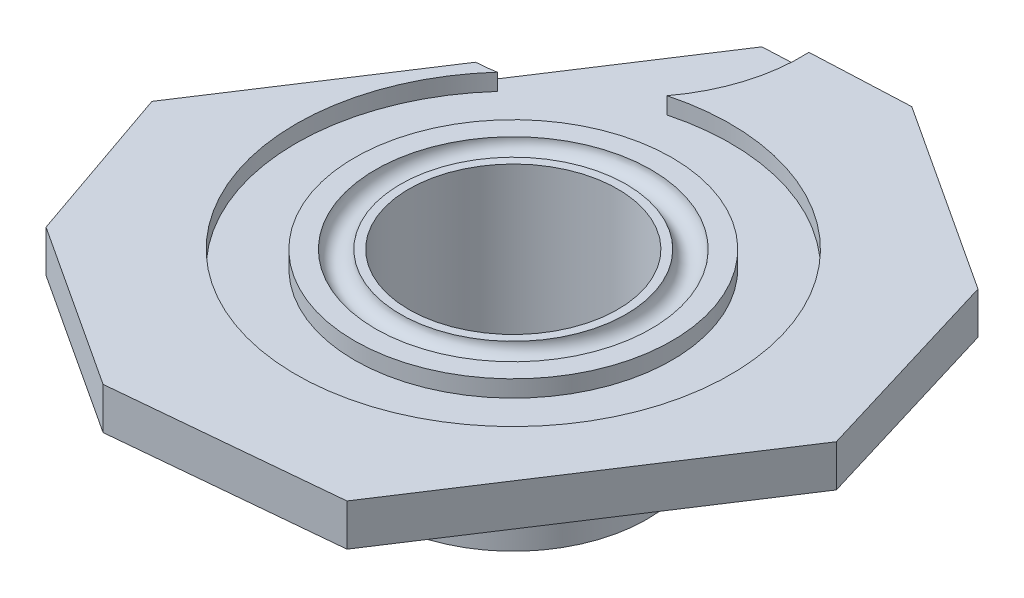
ISO-10303-21;
HEADER;
FILE_DESCRIPTION(('STEP AP214'),'2;1');
FILE_NAME('part.step','',(''),(''),'','','');
FILE_SCHEMA(('AUTOMOTIVE_DESIGN { 1 0 10303 214 1 1 1 1 }'));
ENDSEC;
DATA;
#1=APPLICATION_CONTEXT('core data for automotive mechanical design processes');
#2=APPLICATION_PROTOCOL_DEFINITION('international standard','automotive_design',2000,#1);
#3=PRODUCT_CONTEXT('',#1,'mechanical');
#4=PRODUCT('Part','Part','',(#3));
#5=PRODUCT_RELATED_PRODUCT_CATEGORY('part','',(#4));
#6=PRODUCT_DEFINITION_FORMATION('','',#4);
#7=PRODUCT_DEFINITION_CONTEXT('part definition',#1,'design');
#8=PRODUCT_DEFINITION('design','',#6,#7);
#9=PRODUCT_DEFINITION_SHAPE('','',#8);
#10=(LENGTH_UNIT() NAMED_UNIT(*) SI_UNIT(.MILLI.,.METRE.));
#11=(NAMED_UNIT(*) PLANE_ANGLE_UNIT() SI_UNIT($,.RADIAN.));
#12=(NAMED_UNIT(*) SI_UNIT($,.STERADIAN.) SOLID_ANGLE_UNIT());
#13=UNCERTAINTY_MEASURE_WITH_UNIT(LENGTH_MEASURE(1.E-05),#10,'distance_accuracy_value','');
#14=(GEOMETRIC_REPRESENTATION_CONTEXT(3) GLOBAL_UNCERTAINTY_ASSIGNED_CONTEXT((#13)) GLOBAL_UNIT_ASSIGNED_CONTEXT((#10,
#11,#12)) REPRESENTATION_CONTEXT('',''));
#15=CARTESIAN_POINT('',(0.,0.,0.));
#16=DIRECTION('',(0.,0.,1.));
#17=DIRECTION('',(1.,0.,0.));
#18=AXIS2_PLACEMENT_3D('',#15,#16,#17);
#19=CARTESIAN_POINT('',(0.,20.,0.));
#20=DIRECTION('',(0.,1.,0.));
#21=DIRECTION('',(0.,0.,1.));
#22=AXIS2_PLACEMENT_3D('',#19,#20,#21);
#23=PLANE('',#22);
#24=CARTESIAN_POINT('',(-22.7595405446769,20.,-37.1642927951292));
#25=DIRECTION('',(0.,1.,0.));
#26=DIRECTION('',(0.,0.,1.));
#27=AXIS2_PLACEMENT_3D('',#24,#25,#26);
#28=CIRCLE('',#27,20.0570658458404);
#29=CARTESIAN_POINT('',(-21.6470935139552,20.,-17.1381011464852));
#30=VERTEX_POINT('',#29);
#31=CARTESIAN_POINT('',(-19.3146669349685,20.,-17.4052762164249));
#32=VERTEX_POINT('',#31);
#33=EDGE_CURVE('E185',#30,#32,#28,.T.);
#34=ORIENTED_EDGE('',*,*,#33,.F.);
#35=DIRECTION('',(-0.546970069085976,0.,0.837152162706448));
#36=VECTOR('',#35,1.);
#37=CARTESIAN_POINT('',(-36.9589347677914,20.,6.29707701982124));
#38=LINE('',#37,#36);
#39=CARTESIAN_POINT('',(-36.9589347677914,20.,6.29707701982125));
#40=VERTEX_POINT('',#39);
#41=EDGE_CURVE('E53',#30,#40,#38,.T.);
#42=ORIENTED_EDGE('',*,*,#41,.T.);
#43=DIRECTION('',(0.326695918463785,0.,0.945129502692146));
#44=VECTOR('',#43,1.);
#45=CARTESIAN_POINT('',(-30.2604215395463,20.,25.6758390991212));
#46=LINE('',#45,#44);
#47=CARTESIAN_POINT('',(-30.2604215395463,20.,25.6758390991212));
#48=VERTEX_POINT('',#47);
#49=EDGE_CURVE('E122',#40,#48,#46,.T.);
#50=ORIENTED_EDGE('',*,*,#49,.T.);
#51=DIRECTION('',(0.837169104331042,0.,0.546944138604265));
#52=VECTOR('',#51,1.);
#53=CARTESIAN_POINT('',(-10.5432375414023,20.,38.5575832554395));
#54=LINE('',#53,#52);
#55=CARTESIAN_POINT('',(-10.5432375414023,20.,38.5575832554395));
#56=VERTEX_POINT('',#55);
#57=EDGE_CURVE('E130',#48,#56,#54,.T.);
#58=ORIENTED_EDGE('',*,*,#57,.T.);
#59=DIRECTION('',(0.995607651322571,0.,-0.0936237396601654));
#60=VECTOR('',#59,1.);
#61=CARTESIAN_POINT('',(-10.5432375414023,20.,38.5575832554395));
#62=LINE('',#61,#60);
#63=CARTESIAN_POINT('',(16.1383519412033,20.,36.0485324419786));
#64=VERTEX_POINT('',#63);
#65=EDGE_CURVE('E136',#56,#64,#62,.T.);
#66=ORIENTED_EDGE('',*,*,#65,.T.);
#67=DIRECTION('',(0.546944138604265,0.,-0.837169104331042));
#68=VECTOR('',#67,1.);
#69=CARTESIAN_POINT('',(16.1383519412033,20.,36.0485324419786));
#70=LINE('',#69,#68);
#71=CARTESIAN_POINT('',(39.2880738807601,20.,0.614873657175752));
#72=VERTEX_POINT('',#71);
#73=EDGE_CURVE('E143',#64,#72,#70,.T.);
#74=ORIENTED_EDGE('',*,*,#73,.T.);
#75=DIRECTION('',(-0.289578558466997,0.,-0.957154250095655));
#76=VECTOR('',#75,1.);
#77=CARTESIAN_POINT('',(39.2880738807601,20.,0.614873657175752));
#78=LINE('',#77,#76);
#79=CARTESIAN_POINT('',(31.9335101240895,20.,-23.6944260180591));
#80=VERTEX_POINT('',#79);
#81=EDGE_CURVE('E146',#72,#80,#78,.T.);
#82=ORIENTED_EDGE('',*,*,#81,.T.);
#83=DIRECTION('',(-0.837169104331041,0.,-0.546944138604265));
#84=VECTOR('',#83,1.);
#85=CARTESIAN_POINT('',(31.9335101240895,20.,-23.6944260180591));
#86=LINE('',#85,#84);
#87=CARTESIAN_POINT('',(9.06206266722071,20.,-38.636931735498));
#88=VERTEX_POINT('',#87);
#89=EDGE_CURVE('E149',#80,#88,#86,.T.);
#90=ORIENTED_EDGE('',*,*,#89,.T.);
#91=DIRECTION('',(-0.998993735828921,0.,0.0448499250230883));
#92=VECTOR('',#91,1.);
#93=CARTESIAN_POINT('',(-8.10393570842878,20.,-37.8662624985628));
#94=LINE('',#93,#92);
#95=CARTESIAN_POINT('',(-2.72467716071014,20.,-38.1077648562776));
#96=VERTEX_POINT('',#95);
#97=EDGE_CURVE('E152',#88,#96,#94,.T.);
#98=ORIENTED_EDGE('',*,*,#97,.T.);
#99=CARTESIAN_POINT('',(-6.72502757382133,20.,-25.1152146506468));
#100=VERTEX_POINT('',#99);
#101=EDGE_CURVE('E180',#100,#96,#28,.T.);
#102=ORIENTED_EDGE('',*,*,#101,.F.);
#103=CARTESIAN_POINT('',(1.00775304767708E-07,20.,-8.43366765312936E-08));
#104=DIRECTION('',(0.,1.,0.));
#105=DIRECTION('',(0.,0.,1.));
#106=AXIS2_PLACEMENT_3D('',#103,#104,#105);
#107=CIRCLE('',#106,25.999999998767);
#108=EDGE_CURVE('E196',#32,#100,#107,.T.);
#109=ORIENTED_EDGE('',*,*,#108,.F.);
#110=EDGE_LOOP('',(#34,#42,#50,#58,#66,#74,#82,#90,#98,#102,#109));
#111=FACE_BOUND('',#110,.T.);
#112=ADVANCED_FACE('F31',(#111),#23,.T.);
#113=CARTESIAN_POINT('',(0.,15.,0.));
#114=DIRECTION('',(0.,-1.,0.));
#115=DIRECTION('',(0.,0.,-1.));
#116=AXIS2_PLACEMENT_3D('',#113,#114,#115);
#117=PLANE('',#116);
#118=CARTESIAN_POINT('',(0.,15.,0.));
#119=DIRECTION('',(0.,-1.,0.));
#120=DIRECTION('',(0.,0.,-1.));
#121=AXIS2_PLACEMENT_3D('',#118,#119,#120);
#122=CIRCLE('',#121,21.);
#123=CARTESIAN_POINT('',(0.,15.,-21.));
#124=VERTEX_POINT('',#123);
#125=EDGE_CURVE('E222',#124,#124,#122,.F.);
#126=ORIENTED_EDGE('',*,*,#125,.T.);
#127=EDGE_LOOP('',(#126));
#128=FACE_BOUND('',#127,.T.);
#129=DIRECTION('',(-0.326695918463785,0.,-0.945129502692147));
#130=VECTOR('',#129,1.);
#131=CARTESIAN_POINT('',(-34.958647575509,15.,12.0838969108477));
#132=LINE('',#131,#130);
#133=CARTESIAN_POINT('',(-30.2604215395463,15.,25.6758390991212));
#134=VERTEX_POINT('',#133);
#135=CARTESIAN_POINT('',(-36.9589347677914,15.,6.29707701982124));
#136=VERTEX_POINT('',#135);
#137=EDGE_CURVE('E124',#134,#136,#132,.T.);
#138=ORIENTED_EDGE('',*,*,#137,.T.);
#139=DIRECTION('',(0.546970069085976,0.,-0.837152162706448));
#140=VECTOR('',#139,1.);
#141=CARTESIAN_POINT('',(-23.0182852344887,15.,-15.0394559386259));
#142=LINE('',#141,#140);
#143=CARTESIAN_POINT('',(-8.10393570842878,15.,-37.8662624985628));
#144=VERTEX_POINT('',#143);
#145=EDGE_CURVE('E171',#136,#144,#142,.T.);
#146=ORIENTED_EDGE('',*,*,#145,.T.);
#147=DIRECTION('',(0.998993735828921,0.,-0.0448499250230883));
#148=VECTOR('',#147,1.);
#149=CARTESIAN_POINT('',(-1.71289129100912,15.,-38.1531890854474));
#150=LINE('',#149,#148);
#151=CARTESIAN_POINT('',(9.06206266722071,15.,-38.636931735498));
#152=VERTEX_POINT('',#151);
#153=EDGE_CURVE('E177',#144,#152,#150,.T.);
#154=ORIENTED_EDGE('',*,*,#153,.T.);
#155=DIRECTION('',(0.837169104331042,0.,0.546944138604265));
#156=VECTOR('',#155,1.);
#157=CARTESIAN_POINT('',(20.4021581675734,15.,-31.2281552612555));
#158=LINE('',#157,#156);
#159=CARTESIAN_POINT('',(31.9335101240895,15.,-23.6944260180591));
#160=VERTEX_POINT('',#159);
#161=EDGE_CURVE('E11',#152,#160,#158,.T.);
#162=ORIENTED_EDGE('',*,*,#161,.T.);
#163=DIRECTION('',(0.289578558466997,0.,0.957154250095655));
#164=VECTOR('',#163,1.);
#165=CARTESIAN_POINT('',(35.8231179520535,15.,-10.8379677103373));
#166=LINE('',#165,#164);
#167=CARTESIAN_POINT('',(39.2880738807601,15.,0.614873657175752));
#168=VERTEX_POINT('',#167);
#169=EDGE_CURVE('E39',#160,#168,#166,.T.);
#170=ORIENTED_EDGE('',*,*,#169,.T.);
#171=DIRECTION('',(-0.546944138604265,0.,0.837169104331042));
#172=VECTOR('',#171,1.);
#173=CARTESIAN_POINT('',(27.8166707089103,15.,18.1733474408144));
#174=LINE('',#173,#172);
#175=CARTESIAN_POINT('',(16.1383519412033,15.,36.0485324419786));
#176=VERTEX_POINT('',#175);
#177=EDGE_CURVE('E235',#168,#176,#174,.T.);
#178=ORIENTED_EDGE('',*,*,#177,.T.);
#179=DIRECTION('',(-0.995607651322571,0.,0.0936237396601654));
#180=VECTOR('',#179,1.);
#181=CARTESIAN_POINT('',(3.50163343144086,15.,37.2368487856157));
#182=LINE('',#181,#180);
#183=CARTESIAN_POINT('',(-10.5432375414023,15.,38.5575832554395));
#184=VERTEX_POINT('',#183);
#185=EDGE_CURVE('E232',#176,#184,#182,.T.);
#186=ORIENTED_EDGE('',*,*,#185,.T.);
#187=DIRECTION('',(-0.837169104331042,0.,-0.546944138604265));
#188=VECTOR('',#187,1.);
#189=CARTESIAN_POINT('',(-20.8089160492868,15.,31.8507510758529));
#190=LINE('',#189,#188);
#191=EDGE_CURVE('E230',#184,#134,#190,.T.);
#192=ORIENTED_EDGE('',*,*,#191,.T.);
#193=EDGE_LOOP('',(#138,#146,#154,#162,#170,#178,#186,#192));
#194=FACE_BOUND('',#193,.T.);
#195=ADVANCED_FACE('F239',(#128,#194),#117,.T.);
#196=CARTESIAN_POINT('',(1.00775304767708E-07,18.,-8.43366765312936E-08));
#197=DIRECTION('',(0.,1.,0.));
#198=DIRECTION('',(0.,0.,1.));
#199=AXIS2_PLACEMENT_3D('',#196,#197,#198);
#200=PLANE('',#199);
#201=CARTESIAN_POINT('',(1.00775304767708E-07,18.,-8.43366765312936E-08));
#202=DIRECTION('',(0.,1.,0.));
#203=DIRECTION('',(0.,0.,1.));
#204=AXIS2_PLACEMENT_3D('',#201,#202,#203);
#205=CIRCLE('',#204,18.999999998767);
#206=CARTESIAN_POINT('',(1.00775304767708E-07,18.,18.9999999144304));
#207=VERTEX_POINT('',#206);
#208=EDGE_CURVE('E193',#207,#207,#205,.T.);
#209=ORIENTED_EDGE('',*,*,#208,.F.);
#210=EDGE_LOOP('',(#209));
#211=FACE_BOUND('',#210,.T.);
#212=DIRECTION('',(-0.998993735828921,0.,0.0448499250230883));
#213=VECTOR('',#212,1.);
#214=CARTESIAN_POINT('',(-1.71289118665784,18.,-38.1531890901323));
#215=LINE('',#214,#213);
#216=CARTESIAN_POINT('',(-2.72467716071014,18.,-38.1077648562776));
#217=VERTEX_POINT('',#216);
#218=CARTESIAN_POINT('',(-8.10393570842878,18.,-37.8662624985628));
#219=VERTEX_POINT('',#218);
#220=EDGE_CURVE('E174',#217,#219,#215,.T.);
#221=ORIENTED_EDGE('',*,*,#220,.T.);
#222=DIRECTION('',(-0.546970069085976,0.,0.837152162706448));
#223=VECTOR('',#222,1.);
#224=CARTESIAN_POINT('',(-23.0182851657216,18.,-15.0394560438758));
#225=LINE('',#224,#223);
#226=CARTESIAN_POINT('',(-21.6470935139552,18.,-17.1381011464852));
#227=VERTEX_POINT('',#226);
#228=EDGE_CURVE('E158',#219,#227,#225,.T.);
#229=ORIENTED_EDGE('',*,*,#228,.T.);
#230=CARTESIAN_POINT('',(-22.7595405446769,18.,-37.1642927951292));
#231=DIRECTION('',(0.,1.,0.));
#232=DIRECTION('',(0.,0.,1.));
#233=AXIS2_PLACEMENT_3D('',#230,#231,#232);
#234=CIRCLE('',#233,20.0570658458404);
#235=CARTESIAN_POINT('',(-19.3146669349685,18.,-17.4052762164249));
#236=VERTEX_POINT('',#235);
#237=EDGE_CURVE('E181',#227,#236,#234,.T.);
#238=ORIENTED_EDGE('',*,*,#237,.T.);
#239=CARTESIAN_POINT('',(1.00775304767708E-07,18.,-8.43366765312936E-08));
#240=DIRECTION('',(0.,1.,0.));
#241=DIRECTION('',(0.,0.,1.));
#242=AXIS2_PLACEMENT_3D('',#239,#240,#241);
#243=CIRCLE('',#242,25.999999998767);
#244=CARTESIAN_POINT('',(-6.72502757382133,18.,-25.1152146506468));
#245=VERTEX_POINT('',#244);
#246=EDGE_CURVE('E199',#236,#245,#243,.T.);
#247=ORIENTED_EDGE('',*,*,#246,.T.);
#248=EDGE_CURVE('E184',#245,#217,#234,.T.);
#249=ORIENTED_EDGE('',*,*,#248,.T.);
#250=EDGE_LOOP('',(#221,#229,#238,#247,#249));
#251=FACE_BOUND('',#250,.T.);
#252=ADVANCED_FACE('F263',(#211,#251),#200,.T.);
#253=CARTESIAN_POINT('',(-22.7595405446769,18.,-37.1642927951292));
#254=DIRECTION('',(0.,1.,0.));
#255=DIRECTION('',(0.,0.,1.));
#256=AXIS2_PLACEMENT_3D('',#253,#254,#255);
#257=CYLINDRICAL_SURFACE('',#256,20.0570658458404);
#258=DIRECTION('',(0.,1.,0.));
#259=VECTOR('',#258,1.);
#260=CARTESIAN_POINT('',(-2.72467716071014,18.,-38.1077648562776));
#261=LINE('',#260,#259);
#262=EDGE_CURVE('E227',#217,#96,#261,.T.);
#263=ORIENTED_EDGE('',*,*,#262,.F.);
#264=ORIENTED_EDGE('',*,*,#248,.F.);
#265=DIRECTION('',(0.,1.,0.));
#266=VECTOR('',#265,1.);
#267=CARTESIAN_POINT('',(-6.72502757382133,19.,-25.1152146506468));
#268=LINE('',#267,#266);
#269=EDGE_CURVE('E183',#100,#245,#268,.F.);
#270=ORIENTED_EDGE('',*,*,#269,.F.);
#271=ORIENTED_EDGE('',*,*,#101,.T.);
#272=EDGE_LOOP('',(#263,#264,#270,#271));
#273=FACE_BOUND('',#272,.T.);
#274=ADVANCED_FACE('F267',(#273),#257,.F.);
#275=DIRECTION('',(0.,1.,0.));
#276=VECTOR('',#275,1.);
#277=CARTESIAN_POINT('',(-21.6470935139552,18.,-17.1381011464852));
#278=LINE('',#277,#276);
#279=EDGE_CURVE('E225',#30,#227,#278,.F.);
#280=ORIENTED_EDGE('',*,*,#279,.F.);
#281=ORIENTED_EDGE('',*,*,#33,.T.);
#282=DIRECTION('',(0.,1.,0.));
#283=VECTOR('',#282,1.);
#284=CARTESIAN_POINT('',(-19.3146669349685,19.,-17.4052762164249));
#285=LINE('',#284,#283);
#286=EDGE_CURVE('E189',#236,#32,#285,.T.);
#287=ORIENTED_EDGE('',*,*,#286,.F.);
#288=ORIENTED_EDGE('',*,*,#237,.F.);
#289=EDGE_LOOP('',(#280,#281,#287,#288));
#290=FACE_BOUND('',#289,.T.);
#291=ADVANCED_FACE('F275',(#290),#257,.F.);
#292=CARTESIAN_POINT('',(0.,20.,0.));
#293=DIRECTION('',(0.,1.,0.));
#294=DIRECTION('',(0.,0.,1.));
#295=AXIS2_PLACEMENT_3D('',#292,#293,#294);
#296=CIRCLE('',#295,16.5);
#297=CARTESIAN_POINT('',(0.,20.,16.5));
#298=VERTEX_POINT('',#297);
#299=EDGE_CURVE('E215',#298,#298,#296,.F.);
#300=ORIENTED_EDGE('',*,*,#299,.T.);
#301=EDGE_LOOP('',(#300));
#302=FACE_BOUND('',#301,.T.);
#303=CARTESIAN_POINT('',(1.00775304767708E-07,20.,-8.43366765312936E-08));
#304=DIRECTION('',(0.,1.,0.));
#305=DIRECTION('',(0.,0.,1.));
#306=AXIS2_PLACEMENT_3D('',#303,#304,#305);
#307=CIRCLE('',#306,18.999999998767);
#308=CARTESIAN_POINT('',(1.00775304767708E-07,20.,18.9999999144304));
#309=VERTEX_POINT('',#308);
#310=EDGE_CURVE('E192',#309,#309,#307,.T.);
#311=ORIENTED_EDGE('',*,*,#310,.T.);
#312=EDGE_LOOP('',(#311));
#313=FACE_BOUND('',#312,.T.);
#314=ADVANCED_FACE('F277',(#302,#313),#23,.T.);
#315=CARTESIAN_POINT('',(0.,0.,0.));
#316=DIRECTION('',(0.,1.,0.));
#317=DIRECTION('',(0.,0.,1.));
#318=AXIS2_PLACEMENT_3D('',#315,#316,#317);
#319=PLANE('',#318);
#320=CARTESIAN_POINT('',(0.,0.,0.));
#321=DIRECTION('',(0.,1.,0.));
#322=DIRECTION('',(0.,0.,1.));
#323=AXIS2_PLACEMENT_3D('',#320,#321,#322);
#324=CIRCLE('',#323,12.5);
#325=CARTESIAN_POINT('',(0.,0.,12.5));
#326=VERTEX_POINT('',#325);
#327=EDGE_CURVE('E212',#326,#326,#324,.T.);
#328=ORIENTED_EDGE('',*,*,#327,.T.);
#329=EDGE_LOOP('',(#328));
#330=FACE_BOUND('',#329,.T.);
#331=CARTESIAN_POINT('',(0.,0.,0.));
#332=DIRECTION('',(0.,-1.,0.));
#333=DIRECTION('',(0.,0.,-1.));
#334=AXIS2_PLACEMENT_3D('',#331,#332,#333);
#335=CIRCLE('',#334,16.);
#336=CARTESIAN_POINT('',(0.,0.,-16.));
#337=VERTEX_POINT('',#336);
#338=EDGE_CURVE('E202',#337,#337,#335,.T.);
#339=ORIENTED_EDGE('',*,*,#338,.T.);
#340=EDGE_LOOP('',(#339));
#341=FACE_BOUND('',#340,.T.);
#342=ADVANCED_FACE('F283',(#330,#341),#319,.F.);
#343=CARTESIAN_POINT('',(0.,20.,0.));
#344=DIRECTION('',(0.,1.,0.));
#345=DIRECTION('',(0.,0.,1.));
#346=AXIS2_PLACEMENT_3D('',#343,#344,#345);
#347=CIRCLE('',#346,12.5);
#348=CARTESIAN_POINT('',(0.,20.,12.5));
#349=VERTEX_POINT('',#348);
#350=EDGE_CURVE('E208',#349,#349,#347,.T.);
#351=ORIENTED_EDGE('',*,*,#350,.F.);
#352=EDGE_LOOP('',(#351));
#353=FACE_BOUND('',#352,.T.);
#354=CARTESIAN_POINT('',(0.,20.,0.));
#355=DIRECTION('',(0.,-1.,0.));
#356=DIRECTION('',(0.,0.,-1.));
#357=AXIS2_PLACEMENT_3D('',#354,#355,#356);
#358=CIRCLE('',#357,13.5);
#359=CARTESIAN_POINT('',(0.,20.,-13.5));
#360=VERTEX_POINT('',#359);
#361=EDGE_CURVE('E207',#360,#360,#358,.F.);
#362=ORIENTED_EDGE('',*,*,#361,.T.);
#363=EDGE_LOOP('',(#362));
#364=FACE_BOUND('',#363,.T.);
#365=ADVANCED_FACE('F286',(#353,#364),#23,.T.);
#366=CARTESIAN_POINT('',(0.,20.,0.));
#367=DIRECTION('',(0.,-1.,0.));
#368=DIRECTION('',(0.,0.,-1.));
#369=AXIS2_PLACEMENT_3D('',#366,#367,#368);
#370=CYLINDRICAL_SURFACE('',#369,12.5);
#371=ORIENTED_EDGE('',*,*,#350,.T.);
#372=EDGE_LOOP('',(#371));
#373=FACE_BOUND('',#372,.T.);
#374=ORIENTED_EDGE('',*,*,#327,.F.);
#375=EDGE_LOOP('',(#374));
#376=FACE_BOUND('',#375,.T.);
#377=ADVANCED_FACE('F297',(#373,#376),#370,.F.);
#378=CARTESIAN_POINT('',(0.,20.,0.));
#379=DIRECTION('',(0.,-1.,0.));
#380=DIRECTION('',(0.,0.,-1.));
#381=AXIS2_PLACEMENT_3D('',#378,#379,#380);
#382=TOROIDAL_SURFACE('',#381,15.,1.5);
#383=ORIENTED_EDGE('',*,*,#299,.F.);
#384=EDGE_LOOP('',(#383));
#385=FACE_BOUND('',#384,.T.);
#386=ORIENTED_EDGE('',*,*,#361,.F.);
#387=EDGE_LOOP('',(#386));
#388=FACE_BOUND('',#387,.T.);
#389=ADVANCED_FACE('F303',(#385,#388),#382,.F.);
#390=CARTESIAN_POINT('',(0.,15.,0.));
#391=DIRECTION('',(0.,-1.,0.));
#392=DIRECTION('',(0.,0.,-1.));
#393=AXIS2_PLACEMENT_3D('',#390,#391,#392);
#394=CYLINDRICAL_SURFACE('',#393,16.);
#395=CARTESIAN_POINT('',(0.,10.,0.));
#396=DIRECTION('',(0.,-1.,0.));
#397=DIRECTION('',(0.,0.,-1.));
#398=AXIS2_PLACEMENT_3D('',#395,#396,#397);
#399=CIRCLE('',#398,16.);
#400=CARTESIAN_POINT('',(0.,10.,-16.));
#401=VERTEX_POINT('',#400);
#402=EDGE_CURVE('E211',#401,#401,#399,.T.);
#403=ORIENTED_EDGE('',*,*,#402,.T.);
#404=EDGE_LOOP('',(#403));
#405=FACE_BOUND('',#404,.T.);
#406=ORIENTED_EDGE('',*,*,#338,.F.);
#407=EDGE_LOOP('',(#406));
#408=FACE_BOUND('',#407,.T.);
#409=ADVANCED_FACE('F311',(#405,#408),#394,.T.);
#410=CARTESIAN_POINT('',(0.,10.,0.));
#411=DIRECTION('',(0.,-1.,0.));
#412=DIRECTION('',(0.,0.,-1.));
#413=AXIS2_PLACEMENT_3D('',#410,#411,#412);
#414=TOROIDAL_SURFACE('',#413,21.,5.);
#415=ORIENTED_EDGE('',*,*,#125,.F.);
#416=EDGE_LOOP('',(#415));
#417=FACE_BOUND('',#416,.T.);
#418=ORIENTED_EDGE('',*,*,#402,.F.);
#419=EDGE_LOOP('',(#418));
#420=FACE_BOUND('',#419,.T.);
#421=ADVANCED_FACE('F33',(#417,#420),#414,.F.);
#422=CARTESIAN_POINT('',(1.00775304767708E-07,18.,-8.43366765312936E-08));
#423=DIRECTION('',(0.,1.,0.));
#424=DIRECTION('',(0.,0.,1.));
#425=AXIS2_PLACEMENT_3D('',#422,#423,#424);
#426=CYLINDRICAL_SURFACE('',#425,25.999999998767);
#427=ORIENTED_EDGE('',*,*,#246,.F.);
#428=ORIENTED_EDGE('',*,*,#286,.T.);
#429=ORIENTED_EDGE('',*,*,#108,.T.);
#430=ORIENTED_EDGE('',*,*,#269,.T.);
#431=EDGE_LOOP('',(#427,#428,#429,#430));
#432=FACE_BOUND('',#431,.T.);
#433=ADVANCED_FACE('F271',(#432),#426,.F.);
#434=CARTESIAN_POINT('',(1.00775304767708E-07,18.,-8.43366765312936E-08));
#435=DIRECTION('',(0.,1.,0.));
#436=DIRECTION('',(0.,0.,1.));
#437=AXIS2_PLACEMENT_3D('',#434,#435,#436);
#438=CYLINDRICAL_SURFACE('',#437,18.999999998767);
#439=ORIENTED_EDGE('',*,*,#208,.T.);
#440=EDGE_LOOP('',(#439));
#441=FACE_BOUND('',#440,.T.);
#442=ORIENTED_EDGE('',*,*,#310,.F.);
#443=EDGE_LOOP('',(#442));
#444=FACE_BOUND('',#443,.T.);
#445=ADVANCED_FACE('F323',(#441,#444),#438,.T.);
#446=CARTESIAN_POINT('',(-36.9589347677914,10.,6.29707701982124));
#447=DIRECTION('',(-0.837152162706447,0.,-0.546970069085976));
#448=DIRECTION('',(-0.546970069085976,0.,0.837152162706448));
#449=AXIS2_PLACEMENT_3D('',#446,#447,#448);
#450=PLANE('',#449);
#451=DIRECTION('',(0.,1.,0.));
#452=VECTOR('',#451,1.);
#453=CARTESIAN_POINT('',(-36.9589347677914,10.,6.29707701982124));
#454=LINE('',#453,#452);
#455=EDGE_CURVE('E46',#136,#40,#454,.T.);
#456=ORIENTED_EDGE('',*,*,#455,.T.);
#457=ORIENTED_EDGE('',*,*,#41,.F.);
#458=ORIENTED_EDGE('',*,*,#279,.T.);
#459=ORIENTED_EDGE('',*,*,#228,.F.);
#460=DIRECTION('',(0.,1.,0.));
#461=VECTOR('',#460,1.);
#462=CARTESIAN_POINT('',(-8.10393570842878,10.,-37.8662624985628));
#463=LINE('',#462,#461);
#464=EDGE_CURVE('E155',#144,#219,#463,.T.);
#465=ORIENTED_EDGE('',*,*,#464,.F.);
#466=ORIENTED_EDGE('',*,*,#145,.F.);
#467=EDGE_LOOP('',(#456,#457,#458,#459,#465,#466));
#468=FACE_BOUND('',#467,.T.);
#469=ADVANCED_FACE('F257',(#468),#450,.T.);
#470=CARTESIAN_POINT('',(-8.10393570842878,10.,-37.8662624985628));
#471=DIRECTION('',(-0.0448499250230883,0.,-0.998993735828921));
#472=DIRECTION('',(-0.998993735828921,0.,0.0448499250230883));
#473=AXIS2_PLACEMENT_3D('',#470,#471,#472);
#474=PLANE('',#473);
#475=ORIENTED_EDGE('',*,*,#464,.T.);
#476=ORIENTED_EDGE('',*,*,#220,.F.);
#477=ORIENTED_EDGE('',*,*,#262,.T.);
#478=ORIENTED_EDGE('',*,*,#97,.F.);
#479=DIRECTION('',(0.,1.,0.));
#480=VECTOR('',#479,1.);
#481=CARTESIAN_POINT('',(9.06206266722071,10.,-38.636931735498));
#482=LINE('',#481,#480);
#483=EDGE_CURVE('E159',#152,#88,#482,.T.);
#484=ORIENTED_EDGE('',*,*,#483,.F.);
#485=ORIENTED_EDGE('',*,*,#153,.F.);
#486=EDGE_LOOP('',(#475,#476,#477,#478,#484,#485));
#487=FACE_BOUND('',#486,.T.);
#488=ADVANCED_FACE('F259',(#487),#474,.T.);
#489=CARTESIAN_POINT('',(31.9335101240895,10.,-23.6944260180591));
#490=DIRECTION('',(0.546944138604265,0.,-0.837169104331042));
#491=DIRECTION('',(-0.837169104331042,0.,-0.546944138604265));
#492=AXIS2_PLACEMENT_3D('',#489,#490,#491);
#493=PLANE('',#492);
#494=ORIENTED_EDGE('',*,*,#483,.T.);
#495=ORIENTED_EDGE('',*,*,#89,.F.);
#496=DIRECTION('',(0.,1.,0.));
#497=VECTOR('',#496,1.);
#498=CARTESIAN_POINT('',(31.9335101240895,10.,-23.6944260180591));
#499=LINE('',#498,#497);
#500=EDGE_CURVE('E161',#160,#80,#499,.T.);
#501=ORIENTED_EDGE('',*,*,#500,.F.);
#502=ORIENTED_EDGE('',*,*,#161,.F.);
#503=EDGE_LOOP('',(#494,#495,#501,#502));
#504=FACE_BOUND('',#503,.T.);
#505=ADVANCED_FACE('F247',(#504),#493,.T.);
#506=CARTESIAN_POINT('',(39.2880738807601,10.,0.614873657175752));
#507=DIRECTION('',(0.957154250095655,0.,-0.289578558466997));
#508=DIRECTION('',(-0.289578558466997,0.,-0.957154250095655));
#509=AXIS2_PLACEMENT_3D('',#506,#507,#508);
#510=PLANE('',#509);
#511=ORIENTED_EDGE('',*,*,#500,.T.);
#512=ORIENTED_EDGE('',*,*,#81,.F.);
#513=DIRECTION('',(0.,1.,0.));
#514=VECTOR('',#513,1.);
#515=CARTESIAN_POINT('',(39.2880738807601,10.,0.614873657175752));
#516=LINE('',#515,#514);
#517=EDGE_CURVE('E163',#168,#72,#516,.T.);
#518=ORIENTED_EDGE('',*,*,#517,.F.);
#519=ORIENTED_EDGE('',*,*,#169,.F.);
#520=EDGE_LOOP('',(#511,#512,#518,#519));
#521=FACE_BOUND('',#520,.T.);
#522=ADVANCED_FACE('F243',(#521),#510,.T.);
#523=CARTESIAN_POINT('',(16.1383519412033,10.,36.0485324419786));
#524=DIRECTION('',(0.837169104331042,0.,0.546944138604265));
#525=DIRECTION('',(0.546944138604265,0.,-0.837169104331042));
#526=AXIS2_PLACEMENT_3D('',#523,#524,#525);
#527=PLANE('',#526);
#528=ORIENTED_EDGE('',*,*,#517,.T.);
#529=ORIENTED_EDGE('',*,*,#73,.F.);
#530=DIRECTION('',(0.,1.,0.));
#531=VECTOR('',#530,1.);
#532=CARTESIAN_POINT('',(16.1383519412033,10.,36.0485324419786));
#533=LINE('',#532,#531);
#534=EDGE_CURVE('E165',#176,#64,#533,.T.);
#535=ORIENTED_EDGE('',*,*,#534,.F.);
#536=ORIENTED_EDGE('',*,*,#177,.F.);
#537=EDGE_LOOP('',(#528,#529,#535,#536));
#538=FACE_BOUND('',#537,.T.);
#539=ADVANCED_FACE('F253',(#538),#527,.T.);
#540=CARTESIAN_POINT('',(-10.5432375414023,10.,38.5575832554395));
#541=DIRECTION('',(0.0936237396601654,0.,0.995607651322571));
#542=DIRECTION('',(0.995607651322571,0.,-0.0936237396601654));
#543=AXIS2_PLACEMENT_3D('',#540,#541,#542);
#544=PLANE('',#543);
#545=ORIENTED_EDGE('',*,*,#534,.T.);
#546=ORIENTED_EDGE('',*,*,#65,.F.);
#547=DIRECTION('',(0.,1.,0.));
#548=VECTOR('',#547,1.);
#549=CARTESIAN_POINT('',(-10.5432375414023,10.,38.5575832554395));
#550=LINE('',#549,#548);
#551=EDGE_CURVE('E127',#184,#56,#550,.T.);
#552=ORIENTED_EDGE('',*,*,#551,.F.);
#553=ORIENTED_EDGE('',*,*,#185,.F.);
#554=EDGE_LOOP('',(#545,#546,#552,#553));
#555=FACE_BOUND('',#554,.T.);
#556=ADVANCED_FACE('F255',(#555),#544,.T.);
#557=CARTESIAN_POINT('',(-10.5432375414023,10.,38.5575832554395));
#558=DIRECTION('',(-0.546944138604265,0.,0.837169104331042));
#559=DIRECTION('',(0.837169104331042,0.,0.546944138604265));
#560=AXIS2_PLACEMENT_3D('',#557,#558,#559);
#561=PLANE('',#560);
#562=ORIENTED_EDGE('',*,*,#551,.T.);
#563=ORIENTED_EDGE('',*,*,#57,.F.);
#564=DIRECTION('',(0.,1.,0.));
#565=VECTOR('',#564,1.);
#566=CARTESIAN_POINT('',(-30.2604215395463,10.,25.6758390991212));
#567=LINE('',#566,#565);
#568=EDGE_CURVE('E118',#134,#48,#567,.T.);
#569=ORIENTED_EDGE('',*,*,#568,.F.);
#570=ORIENTED_EDGE('',*,*,#191,.F.);
#571=EDGE_LOOP('',(#562,#563,#569,#570));
#572=FACE_BOUND('',#571,.T.);
#573=ADVANCED_FACE('F131',(#572),#561,.T.);
#574=CARTESIAN_POINT('',(-30.2604215395463,10.,25.6758390991212));
#575=DIRECTION('',(-0.945129502692146,0.,0.326695918463785));
#576=DIRECTION('',(0.326695918463785,0.,0.945129502692147));
#577=AXIS2_PLACEMENT_3D('',#574,#575,#576);
#578=PLANE('',#577);
#579=ORIENTED_EDGE('',*,*,#568,.T.);
#580=ORIENTED_EDGE('',*,*,#49,.F.);
#581=ORIENTED_EDGE('',*,*,#455,.F.);
#582=ORIENTED_EDGE('',*,*,#137,.F.);
#583=EDGE_LOOP('',(#579,#580,#581,#582));
#584=FACE_BOUND('',#583,.T.);
#585=ADVANCED_FACE('F120',(#584),#578,.T.);
#586=CLOSED_SHELL('',(#112,#195,#252,#274,#291,#314,#342,#365,#377,#389,#409,#421,#433,#445,
#469,#488,#505,#522,#539,#556,#573,#585));
#587=MANIFOLD_SOLID_BREP('B2',#586);
#588=ADVANCED_BREP_SHAPE_REPRESENTATION('',(#18,#587),#14);
#589=SHAPE_DEFINITION_REPRESENTATION(#9,#588);
ENDSEC;
END-ISO-10303-21;
